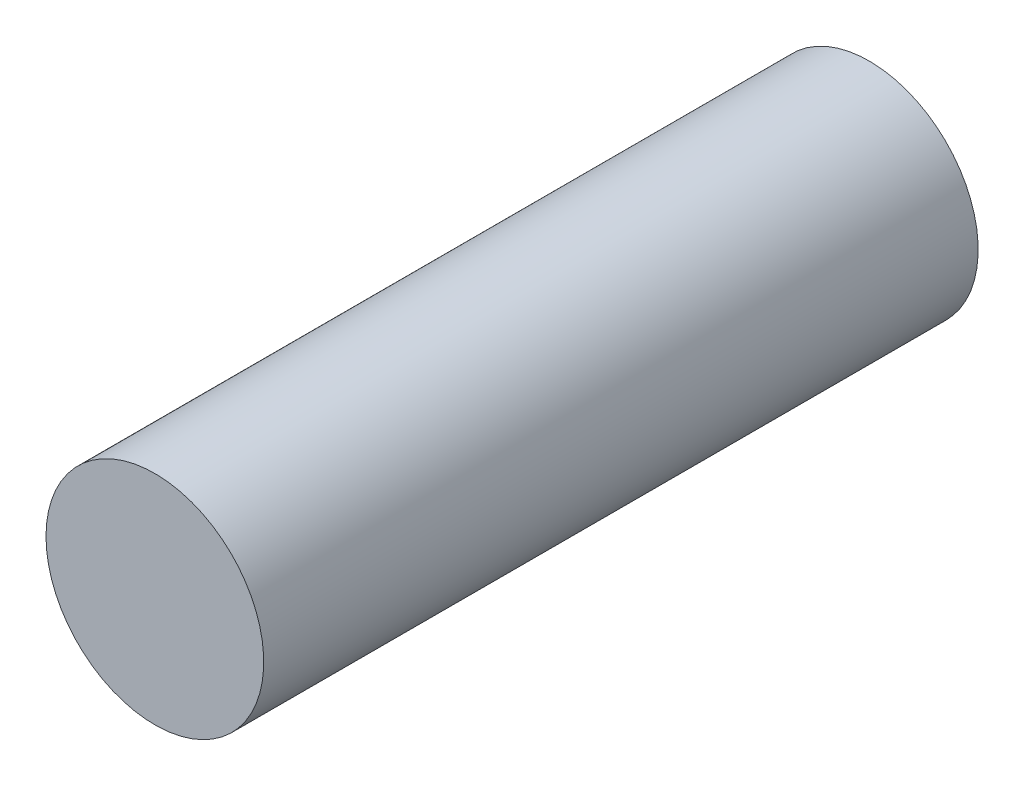
ISO-10303-21;
HEADER;
FILE_DESCRIPTION(('STEP AP214'),'2;1');
FILE_NAME('part.step','',(''),(''),'','','');
FILE_SCHEMA(('AUTOMOTIVE_DESIGN { 1 0 10303 214 1 1 1 1 }'));
ENDSEC;
DATA;
#1=APPLICATION_CONTEXT('core data for automotive mechanical design processes');
#2=APPLICATION_PROTOCOL_DEFINITION('international standard','automotive_design',2000,#1);
#3=PRODUCT_CONTEXT('',#1,'mechanical');
#4=PRODUCT('Part','Part','',(#3));
#5=PRODUCT_RELATED_PRODUCT_CATEGORY('part','',(#4));
#6=PRODUCT_DEFINITION_FORMATION('','',#4);
#7=PRODUCT_DEFINITION_CONTEXT('part definition',#1,'design');
#8=PRODUCT_DEFINITION('design','',#6,#7);
#9=PRODUCT_DEFINITION_SHAPE('','',#8);
#10=(LENGTH_UNIT() NAMED_UNIT(*) SI_UNIT(.MILLI.,.METRE.));
#11=(NAMED_UNIT(*) PLANE_ANGLE_UNIT() SI_UNIT($,.RADIAN.));
#12=(NAMED_UNIT(*) SI_UNIT($,.STERADIAN.) SOLID_ANGLE_UNIT());
#13=UNCERTAINTY_MEASURE_WITH_UNIT(LENGTH_MEASURE(1.E-05),#10,'distance_accuracy_value','');
#14=(GEOMETRIC_REPRESENTATION_CONTEXT(3) GLOBAL_UNCERTAINTY_ASSIGNED_CONTEXT((#13)) GLOBAL_UNIT_ASSIGNED_CONTEXT((#10,
#11,#12)) REPRESENTATION_CONTEXT('',''));
#15=CARTESIAN_POINT('',(0.,0.,0.));
#16=DIRECTION('',(0.,0.,1.));
#17=DIRECTION('',(1.,0.,0.));
#18=AXIS2_PLACEMENT_3D('',#15,#16,#17);
#19=CARTESIAN_POINT('',(0.,0.,31.5));
#20=DIRECTION('',(0.,0.,-1.));
#21=DIRECTION('',(-1.,0.,0.));
#22=AXIS2_PLACEMENT_3D('',#19,#20,#21);
#23=CYLINDRICAL_SURFACE('',#22,6.4);
#24=CARTESIAN_POINT('',(0.,0.,31.5));
#25=DIRECTION('',(0.,0.,1.));
#26=DIRECTION('',(1.,0.,0.));
#27=AXIS2_PLACEMENT_3D('',#24,#25,#26);
#28=CIRCLE('',#27,6.4);
#29=CARTESIAN_POINT('',(-6.4,0.,31.5));
#30=VERTEX_POINT('',#29);
#31=EDGE_CURVE('E10',#30,#30,#28,.T.);
#32=CARTESIAN_POINT('',(0.,0.,-10.5));
#33=DIRECTION('',(0.,0.,1.));
#34=DIRECTION('',(1.,0.,0.));
#35=AXIS2_PLACEMENT_3D('',#32,#33,#34);
#36=CIRCLE('',#35,6.4);
#37=CARTESIAN_POINT('',(-6.4,0.,-10.5));
#38=VERTEX_POINT('',#37);
#39=EDGE_CURVE('E36',#38,#38,#36,.T.);
#40=CARTESIAN_POINT('',(-6.4,0.,31.5));
#41=CARTESIAN_POINT('',(-6.4,0.,31.0625));
#42=CARTESIAN_POINT('',(-6.4,0.,30.625));
#43=CARTESIAN_POINT('',(-6.4,0.,29.75));
#44=CARTESIAN_POINT('',(-6.4,0.,29.3125));
#45=CARTESIAN_POINT('',(-6.4,0.,28.4375));
#46=CARTESIAN_POINT('',(-6.4,0.,28.));
#47=CARTESIAN_POINT('',(-6.4,0.,27.125));
#48=CARTESIAN_POINT('',(-6.4,0.,26.6875));
#49=CARTESIAN_POINT('',(-6.4,0.,25.8125));
#50=CARTESIAN_POINT('',(-6.4,0.,25.375));
#51=CARTESIAN_POINT('',(-6.4,0.,24.5));
#52=CARTESIAN_POINT('',(-6.4,0.,24.0625));
#53=CARTESIAN_POINT('',(-6.4,0.,23.1875));
#54=CARTESIAN_POINT('',(-6.4,0.,22.75));
#55=CARTESIAN_POINT('',(-6.4,0.,21.875));
#56=CARTESIAN_POINT('',(-6.4,0.,21.4375));
#57=CARTESIAN_POINT('',(-6.4,0.,20.5625));
#58=CARTESIAN_POINT('',(-6.4,0.,20.125));
#59=CARTESIAN_POINT('',(-6.4,0.,19.25));
#60=CARTESIAN_POINT('',(-6.4,0.,18.8125));
#61=CARTESIAN_POINT('',(-6.4,0.,17.9375));
#62=CARTESIAN_POINT('',(-6.4,0.,17.5));
#63=CARTESIAN_POINT('',(-6.4,0.,16.625));
#64=CARTESIAN_POINT('',(-6.4,0.,16.1875));
#65=CARTESIAN_POINT('',(-6.4,0.,15.3125));
#66=CARTESIAN_POINT('',(-6.4,0.,14.875));
#67=CARTESIAN_POINT('',(-6.4,0.,14.));
#68=CARTESIAN_POINT('',(-6.4,0.,13.5625));
#69=CARTESIAN_POINT('',(-6.4,0.,12.6875));
#70=CARTESIAN_POINT('',(-6.4,0.,12.25));
#71=CARTESIAN_POINT('',(-6.4,0.,11.375));
#72=CARTESIAN_POINT('',(-6.4,0.,10.9375));
#73=CARTESIAN_POINT('',(-6.4,0.,10.0625));
#74=CARTESIAN_POINT('',(-6.4,0.,9.62499999999999));
#75=CARTESIAN_POINT('',(-6.4,0.,8.74999999999999));
#76=CARTESIAN_POINT('',(-6.4,0.,8.31249999999999));
#77=CARTESIAN_POINT('',(-6.4,0.,7.43749999999999));
#78=CARTESIAN_POINT('',(-6.4,0.,6.99999999999999));
#79=CARTESIAN_POINT('',(-6.4,0.,6.12499999999999));
#80=CARTESIAN_POINT('',(-6.4,0.,5.68749999999999));
#81=CARTESIAN_POINT('',(-6.4,0.,4.81249999999999));
#82=CARTESIAN_POINT('',(-6.4,0.,4.37499999999999));
#83=CARTESIAN_POINT('',(-6.4,0.,3.49999999999999));
#84=CARTESIAN_POINT('',(-6.4,0.,3.06249999999999));
#85=CARTESIAN_POINT('',(-6.4,0.,2.1875));
#86=CARTESIAN_POINT('',(-6.4,0.,1.74999999999999));
#87=CARTESIAN_POINT('',(-6.4,0.,0.874999999999996));
#88=CARTESIAN_POINT('',(-6.4,0.,0.437499999999998));
#89=CARTESIAN_POINT('',(-6.4,0.,-0.4375));
#90=CARTESIAN_POINT('',(-6.4,0.,-0.875000000000001));
#91=CARTESIAN_POINT('',(-6.4,0.,-1.75));
#92=CARTESIAN_POINT('',(-6.4,0.,-2.1875));
#93=CARTESIAN_POINT('',(-6.4,0.,-3.0625));
#94=CARTESIAN_POINT('',(-6.4,0.,-3.5));
#95=CARTESIAN_POINT('',(-6.4,0.,-4.375));
#96=CARTESIAN_POINT('',(-6.4,0.,-4.8125));
#97=CARTESIAN_POINT('',(-6.4,0.,-5.6875));
#98=CARTESIAN_POINT('',(-6.4,0.,-6.125));
#99=CARTESIAN_POINT('',(-6.4,0.,-7.));
#100=CARTESIAN_POINT('',(-6.4,0.,-7.4375));
#101=CARTESIAN_POINT('',(-6.4,0.,-8.3125));
#102=CARTESIAN_POINT('',(-6.4,0.,-8.75));
#103=CARTESIAN_POINT('',(-6.4,0.,-9.625));
#104=CARTESIAN_POINT('',(-6.4,0.,-10.0625));
#105=CARTESIAN_POINT('',(-6.4,0.,-10.5));
#106=B_SPLINE_CURVE_WITH_KNOTS('',3,(#40,#41,#42,#43,#44,#45,#46,#47,#48,#49,#50,#51,#52,#53,
#54,#55,#56,#57,#58,#59,#60,#61,#62,#63,#64,#65,#66,#67,#68,#69,#70,#71,#72,#73,#74,#75,#76,#77,
#78,#79,#80,#81,#82,#83,#84,#85,#86,#87,#88,#89,#90,#91,#92,#93,#94,#95,#96,#97,#98,#99,#100,
#101,#102,#103,#104,#105),.UNSPECIFIED.,.F.,.F.,(4,2,2,2,2,2,2,2,2,2,2,2,2,2,2,2,2,2,2,2,2,2,2,
2,2,2,2,2,2,2,2,2,4),(0.,1.3125,2.625,3.9375,5.25,6.56250000000001,7.875,9.1875,10.5,11.8125,
13.125,14.4375,15.75,17.0625,18.375,19.6875,21.,22.3125,23.625,24.9375,26.25,27.5625,28.875,
30.1875,31.5,32.8125,34.125,35.4375,36.75,38.0625,39.375,40.6875,42.),.UNSPECIFIED.);
#107=EDGE_CURVE('BSEAM33',#30,#38,#106,.T.);
#108=ORIENTED_EDGE('',*,*,#31,.F.);
#109=ORIENTED_EDGE('',*,*,#39,.T.);
#110=ORIENTED_EDGE('',*,*,#107,.T.);
#111=ORIENTED_EDGE('',*,*,#107,.F.);
#112=EDGE_LOOP('',(#108,#110,#109,#111));
#113=FACE_BOUND('',#112,.T.);
#114=ADVANCED_FACE('F33',(#113),#23,.T.);
#115=CARTESIAN_POINT('',(0.,0.,31.5));
#116=DIRECTION('',(0.,0.,1.));
#117=DIRECTION('',(1.,0.,0.));
#118=AXIS2_PLACEMENT_3D('',#115,#116,#117);
#119=PLANE('',#118);
#120=ORIENTED_EDGE('',*,*,#31,.T.);
#121=EDGE_LOOP('',(#120));
#122=FACE_BOUND('',#121,.T.);
#123=ADVANCED_FACE('F48',(#122),#119,.T.);
#124=CARTESIAN_POINT('',(0.,0.,-10.5));
#125=DIRECTION('',(0.,0.,1.));
#126=DIRECTION('',(1.,0.,0.));
#127=AXIS2_PLACEMENT_3D('',#124,#125,#126);
#128=PLANE('',#127);
#129=ORIENTED_EDGE('',*,*,#39,.F.);
#130=EDGE_LOOP('',(#129));
#131=FACE_BOUND('',#130,.T.);
#132=ADVANCED_FACE('F46',(#131),#128,.F.);
#133=CLOSED_SHELL('',(#114,#123,#132));
#134=MANIFOLD_SOLID_BREP('B2',#133);
#135=ADVANCED_BREP_SHAPE_REPRESENTATION('',(#18,#134),#14);
#136=SHAPE_DEFINITION_REPRESENTATION(#9,#135);
ENDSEC;
END-ISO-10303-21;
